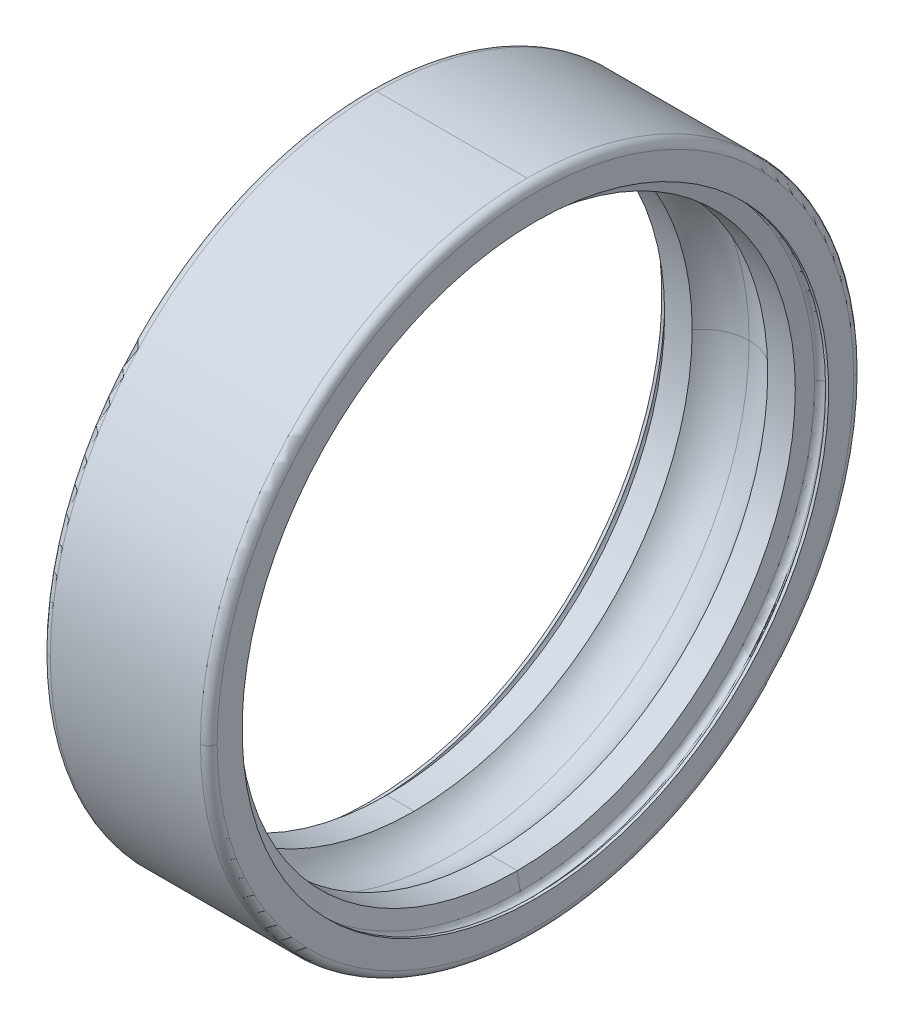
ISO-10303-21;
HEADER;
FILE_DESCRIPTION(('STEP AP214'),'2;1');
FILE_NAME('part.step','',(''),(''),'','','');
FILE_SCHEMA(('AUTOMOTIVE_DESIGN { 1 0 10303 214 1 1 1 1 }'));
ENDSEC;
DATA;
#1=APPLICATION_CONTEXT('core data for automotive mechanical design processes');
#2=APPLICATION_PROTOCOL_DEFINITION('international standard','automotive_design',2000,#1);
#3=PRODUCT_CONTEXT('',#1,'mechanical');
#4=PRODUCT('Part','Part','',(#3));
#5=PRODUCT_RELATED_PRODUCT_CATEGORY('part','',(#4));
#6=PRODUCT_DEFINITION_FORMATION('','',#4);
#7=PRODUCT_DEFINITION_CONTEXT('part definition',#1,'design');
#8=PRODUCT_DEFINITION('design','',#6,#7);
#9=PRODUCT_DEFINITION_SHAPE('','',#8);
#10=(LENGTH_UNIT() NAMED_UNIT(*) SI_UNIT(.MILLI.,.METRE.));
#11=(NAMED_UNIT(*) PLANE_ANGLE_UNIT() SI_UNIT($,.RADIAN.));
#12=(NAMED_UNIT(*) SI_UNIT($,.STERADIAN.) SOLID_ANGLE_UNIT());
#13=UNCERTAINTY_MEASURE_WITH_UNIT(LENGTH_MEASURE(1.E-05),#10,'distance_accuracy_value','');
#14=(GEOMETRIC_REPRESENTATION_CONTEXT(3) GLOBAL_UNCERTAINTY_ASSIGNED_CONTEXT((#13)) GLOBAL_UNIT_ASSIGNED_CONTEXT((#10,
#11,#12)) REPRESENTATION_CONTEXT('',''));
#15=CARTESIAN_POINT('',(0.,0.,0.));
#16=DIRECTION('',(0.,0.,1.));
#17=DIRECTION('',(1.,0.,0.));
#18=AXIS2_PLACEMENT_3D('',#15,#16,#17);
#19=CARTESIAN_POINT('',(11.34,0.,0.));
#20=DIRECTION('',(1.,0.,0.));
#21=DIRECTION('',(0.,0.,-1.));
#22=AXIS2_PLACEMENT_3D('',#19,#20,#21);
#23=TOROIDAL_SURFACE('',#22,21.1,0.44);
#24=CARTESIAN_POINT('',(11.34,0.,0.));
#25=DIRECTION('',(1.,0.,0.));
#26=DIRECTION('',(0.,0.,1.));
#27=AXIS2_PLACEMENT_3D('',#24,#25,#26);
#28=CIRCLE('',#27,21.54);
#29=CARTESIAN_POINT('',(11.34,0.,-21.54));
#30=VERTEX_POINT('',#29);
#31=CARTESIAN_POINT('',(11.34,0.,21.54));
#32=VERTEX_POINT('',#31);
#33=EDGE_CURVE('E483',#30,#32,#28,.T.);
#34=ORIENTED_EDGE('',*,*,#33,.T.);
#35=CARTESIAN_POINT('',(11.34,0.,21.1));
#36=DIRECTION('',(0.,-1.,0.));
#37=DIRECTION('',(0.,0.,1.));
#38=AXIS2_PLACEMENT_3D('',#35,#36,#37);
#39=CIRCLE('',#38,0.44);
#40=CARTESIAN_POINT('',(10.9066845886746,0.,21.1764051981735));
#41=VERTEX_POINT('',#40);
#42=EDGE_CURVE('E269',#32,#41,#39,.T.);
#43=ORIENTED_EDGE('',*,*,#42,.T.);
#44=CARTESIAN_POINT('',(10.9066845886746,0.,0.));
#45=DIRECTION('',(1.,0.,0.));
#46=DIRECTION('',(0.,1.,0.));
#47=AXIS2_PLACEMENT_3D('',#44,#45,#46);
#48=CIRCLE('',#47,21.1764051981735);
#49=CARTESIAN_POINT('',(10.9066845886746,21.1764051981735,0.));
#50=VERTEX_POINT('',#49);
#51=EDGE_CURVE('E34',#50,#41,#48,.T.);
#52=ORIENTED_EDGE('',*,*,#51,.F.);
#53=CARTESIAN_POINT('',(10.9066845886746,0.,0.));
#54=DIRECTION('',(1.,0.,0.));
#55=DIRECTION('',(0.,1.,0.));
#56=AXIS2_PLACEMENT_3D('',#53,#54,#55);
#57=CIRCLE('',#56,21.1764051981735);
#58=CARTESIAN_POINT('',(10.9066845886746,0.,-21.1764051981735));
#59=VERTEX_POINT('',#58);
#60=EDGE_CURVE('E206',#59,#50,#57,.T.);
#61=ORIENTED_EDGE('',*,*,#60,.F.);
#62=CARTESIAN_POINT('',(11.34,0.,-21.1));
#63=DIRECTION('',(0.,-1.,0.));
#64=DIRECTION('',(0.,0.,-1.));
#65=AXIS2_PLACEMENT_3D('',#62,#63,#64);
#66=CIRCLE('',#65,0.44);
#67=EDGE_CURVE('E255',#59,#30,#66,.T.);
#68=ORIENTED_EDGE('',*,*,#67,.T.);
#69=EDGE_LOOP('',(#34,#43,#52,#61,#68));
#70=FACE_BOUND('',#69,.T.);
#71=ADVANCED_FACE('F19',(#70),#23,.F.);
#72=CARTESIAN_POINT('',(11.89,0.,0.));
#73=DIRECTION('',(1.,0.,0.));
#74=DIRECTION('',(0.,1.,0.));
#75=AXIS2_PLACEMENT_3D('',#72,#73,#74);
#76=CYLINDRICAL_SURFACE('',#75,21.1);
#77=DIRECTION('',(1.,0.,0.));
#78=VECTOR('',#77,1.);
#79=CARTESIAN_POINT('',(11.89,21.1,0.));
#80=LINE('',#79,#78);
#81=CARTESIAN_POINT('',(11.78,21.1,0.));
#82=VERTEX_POINT('',#81);
#83=CARTESIAN_POINT('',(12.,21.1,0.));
#84=VERTEX_POINT('',#83);
#85=EDGE_CURVE('E271',#82,#84,#80,.T.);
#86=ORIENTED_EDGE('',*,*,#85,.T.);
#87=CARTESIAN_POINT('',(12.,0.,0.));
#88=DIRECTION('',(1.,0.,0.));
#89=DIRECTION('',(0.,1.,0.));
#90=AXIS2_PLACEMENT_3D('',#87,#88,#89);
#91=CIRCLE('',#90,21.1);
#92=CARTESIAN_POINT('',(12.,-21.1,0.));
#93=VERTEX_POINT('',#92);
#94=EDGE_CURVE('E11',#84,#93,#91,.T.);
#95=ORIENTED_EDGE('',*,*,#94,.T.);
#96=DIRECTION('',(-1.,0.,0.));
#97=VECTOR('',#96,1.);
#98=CARTESIAN_POINT('',(11.89,-21.1,0.));
#99=LINE('',#98,#97);
#100=CARTESIAN_POINT('',(11.78,-21.1,0.));
#101=VERTEX_POINT('',#100);
#102=EDGE_CURVE('E276',#93,#101,#99,.T.);
#103=ORIENTED_EDGE('',*,*,#102,.T.);
#104=CARTESIAN_POINT('',(11.78,0.,0.));
#105=DIRECTION('',(1.,0.,0.));
#106=DIRECTION('',(0.,1.,0.));
#107=AXIS2_PLACEMENT_3D('',#104,#105,#106);
#108=CIRCLE('',#107,21.1);
#109=CARTESIAN_POINT('',(11.78,0.,21.1));
#110=VERTEX_POINT('',#109);
#111=EDGE_CURVE('E244',#110,#101,#108,.T.);
#112=ORIENTED_EDGE('',*,*,#111,.F.);
#113=CARTESIAN_POINT('',(11.78,0.,0.));
#114=DIRECTION('',(1.,0.,0.));
#115=DIRECTION('',(0.,1.,0.));
#116=AXIS2_PLACEMENT_3D('',#113,#114,#115);
#117=CIRCLE('',#116,21.1);
#118=EDGE_CURVE('E469',#82,#110,#117,.T.);
#119=ORIENTED_EDGE('',*,*,#118,.F.);
#120=EDGE_LOOP('',(#86,#95,#103,#112,#119));
#121=FACE_BOUND('',#120,.T.);
#122=ADVANCED_FACE('F502',(#121),#76,.F.);
#123=CARTESIAN_POINT('',(12.,22.,0.));
#124=DIRECTION('',(1.,0.,0.));
#125=DIRECTION('',(0.,1.,0.));
#126=AXIS2_PLACEMENT_3D('',#123,#124,#125);
#127=PLANE('',#126);
#128=ORIENTED_EDGE('',*,*,#94,.F.);
#129=CARTESIAN_POINT('',(12.,0.,0.));
#130=DIRECTION('',(1.,0.,0.));
#131=DIRECTION('',(0.,1.,0.));
#132=AXIS2_PLACEMENT_3D('',#129,#130,#131);
#133=CIRCLE('',#132,21.1);
#134=EDGE_CURVE('E279',#93,#84,#133,.T.);
#135=ORIENTED_EDGE('',*,*,#134,.F.);
#136=EDGE_LOOP('',(#128,#135));
#137=FACE_BOUND('',#136,.T.);
#138=CARTESIAN_POINT('',(12.,0.,0.));
#139=DIRECTION('',(1.,0.,0.));
#140=DIRECTION('',(0.,1.,0.));
#141=AXIS2_PLACEMENT_3D('',#138,#139,#140);
#142=CIRCLE('',#141,22.9);
#143=CARTESIAN_POINT('',(12.,0.,22.9));
#144=VERTEX_POINT('',#143);
#145=CARTESIAN_POINT('',(12.,0.,-22.9));
#146=VERTEX_POINT('',#145);
#147=EDGE_CURVE('E22',#144,#146,#142,.T.);
#148=ORIENTED_EDGE('',*,*,#147,.T.);
#149=CARTESIAN_POINT('',(12.,0.,0.));
#150=DIRECTION('',(1.,0.,0.));
#151=DIRECTION('',(0.,1.,0.));
#152=AXIS2_PLACEMENT_3D('',#149,#150,#151);
#153=CIRCLE('',#152,22.9);
#154=EDGE_CURVE('E285',#146,#144,#153,.T.);
#155=ORIENTED_EDGE('',*,*,#154,.T.);
#156=EDGE_LOOP('',(#148,#155));
#157=FACE_BOUND('',#156,.T.);
#158=ADVANCED_FACE('F504',(#137,#157),#127,.T.);
#159=CARTESIAN_POINT('',(11.4,0.,0.));
#160=DIRECTION('',(1.,0.,0.));
#161=DIRECTION('',(0.,0.,-1.));
#162=AXIS2_PLACEMENT_3D('',#159,#160,#161);
#163=TOROIDAL_SURFACE('',#162,22.9,0.6);
#164=CARTESIAN_POINT('',(11.4,0.,-22.9));
#165=DIRECTION('',(0.,-1.,0.));
#166=DIRECTION('',(0.,0.,-1.));
#167=AXIS2_PLACEMENT_3D('',#164,#165,#166);
#168=CIRCLE('',#167,0.6);
#169=CARTESIAN_POINT('',(11.4,0.,-23.5));
#170=VERTEX_POINT('',#169);
#171=EDGE_CURVE('E282',#170,#146,#168,.T.);
#172=ORIENTED_EDGE('',*,*,#171,.T.);
#173=ORIENTED_EDGE('',*,*,#147,.F.);
#174=CARTESIAN_POINT('',(11.4,0.,22.9));
#175=DIRECTION('',(0.,-1.,0.));
#176=DIRECTION('',(0.,0.,1.));
#177=AXIS2_PLACEMENT_3D('',#174,#175,#176);
#178=CIRCLE('',#177,0.6);
#179=CARTESIAN_POINT('',(11.4,0.,23.5));
#180=VERTEX_POINT('',#179);
#181=EDGE_CURVE('E289',#144,#180,#178,.T.);
#182=ORIENTED_EDGE('',*,*,#181,.T.);
#183=CARTESIAN_POINT('',(11.4,0.,0.));
#184=DIRECTION('',(1.,0.,0.));
#185=DIRECTION('',(0.,1.,0.));
#186=AXIS2_PLACEMENT_3D('',#183,#184,#185);
#187=CIRCLE('',#186,23.5);
#188=CARTESIAN_POINT('',(11.4,-23.5,0.));
#189=VERTEX_POINT('',#188);
#190=EDGE_CURVE('E299',#180,#189,#187,.T.);
#191=ORIENTED_EDGE('',*,*,#190,.T.);
#192=CARTESIAN_POINT('',(11.4,0.,0.));
#193=DIRECTION('',(1.,0.,0.));
#194=DIRECTION('',(0.,1.,0.));
#195=AXIS2_PLACEMENT_3D('',#192,#193,#194);
#196=CIRCLE('',#195,23.5);
#197=EDGE_CURVE('E216',#189,#170,#196,.T.);
#198=ORIENTED_EDGE('',*,*,#197,.T.);
#199=EDGE_LOOP('',(#172,#173,#182,#191,#198));
#200=FACE_BOUND('',#199,.T.);
#201=ADVANCED_FACE('F422',(#200),#163,.T.);
#202=CARTESIAN_POINT('',(6.,0.,0.));
#203=DIRECTION('',(1.,0.,0.));
#204=DIRECTION('',(0.,1.,0.));
#205=AXIS2_PLACEMENT_3D('',#202,#203,#204);
#206=CYLINDRICAL_SURFACE('',#205,23.5);
#207=DIRECTION('',(1.,0.,0.));
#208=VECTOR('',#207,1.);
#209=CARTESIAN_POINT('',(6.,23.5,0.));
#210=LINE('',#209,#208);
#211=CARTESIAN_POINT('',(0.6,23.5,0.));
#212=VERTEX_POINT('',#211);
#213=CARTESIAN_POINT('',(11.4,23.5,0.));
#214=VERTEX_POINT('',#213);
#215=EDGE_CURVE('E288',#212,#214,#210,.T.);
#216=ORIENTED_EDGE('',*,*,#215,.T.);
#217=CARTESIAN_POINT('',(11.4,0.,0.));
#218=DIRECTION('',(1.,0.,0.));
#219=DIRECTION('',(0.,1.,0.));
#220=AXIS2_PLACEMENT_3D('',#217,#218,#219);
#221=CIRCLE('',#220,23.5);
#222=EDGE_CURVE('E284',#170,#214,#221,.T.);
#223=ORIENTED_EDGE('',*,*,#222,.F.);
#224=ORIENTED_EDGE('',*,*,#197,.F.);
#225=DIRECTION('',(-1.,0.,0.));
#226=VECTOR('',#225,1.);
#227=CARTESIAN_POINT('',(6.,-23.5,0.));
#228=LINE('',#227,#226);
#229=CARTESIAN_POINT('',(0.6,-23.5,0.));
#230=VERTEX_POINT('',#229);
#231=EDGE_CURVE('E297',#189,#230,#228,.T.);
#232=ORIENTED_EDGE('',*,*,#231,.T.);
#233=CARTESIAN_POINT('',(0.6,0.,0.));
#234=DIRECTION('',(1.,0.,0.));
#235=DIRECTION('',(0.,1.,0.));
#236=AXIS2_PLACEMENT_3D('',#233,#234,#235);
#237=CIRCLE('',#236,23.5);
#238=CARTESIAN_POINT('',(0.6,0.,-23.5));
#239=VERTEX_POINT('',#238);
#240=EDGE_CURVE('E215',#230,#239,#237,.T.);
#241=ORIENTED_EDGE('',*,*,#240,.T.);
#242=CARTESIAN_POINT('',(0.6,0.,0.));
#243=DIRECTION('',(1.,0.,0.));
#244=DIRECTION('',(0.,1.,0.));
#245=AXIS2_PLACEMENT_3D('',#242,#243,#244);
#246=CIRCLE('',#245,23.5);
#247=EDGE_CURVE('E311',#239,#212,#246,.T.);
#248=ORIENTED_EDGE('',*,*,#247,.T.);
#249=EDGE_LOOP('',(#216,#223,#224,#232,#241,#248));
#250=FACE_BOUND('',#249,.T.);
#251=ADVANCED_FACE('F415',(#250),#206,.T.);
#252=CARTESIAN_POINT('',(0.6,0.,0.));
#253=DIRECTION('',(1.,0.,0.));
#254=DIRECTION('',(0.,0.,-1.));
#255=AXIS2_PLACEMENT_3D('',#252,#253,#254);
#256=TOROIDAL_SURFACE('',#255,22.9,0.6);
#257=CARTESIAN_POINT('',(0.6,0.,-22.9));
#258=DIRECTION('',(0.,-1.,0.));
#259=DIRECTION('',(0.,0.,-1.));
#260=AXIS2_PLACEMENT_3D('',#257,#258,#259);
#261=CIRCLE('',#260,0.6);
#262=CARTESIAN_POINT('',(0.,0.,-22.9));
#263=VERTEX_POINT('',#262);
#264=EDGE_CURVE('E301',#263,#239,#261,.T.);
#265=ORIENTED_EDGE('',*,*,#264,.T.);
#266=ORIENTED_EDGE('',*,*,#240,.F.);
#267=CARTESIAN_POINT('',(0.6,0.,0.));
#268=DIRECTION('',(1.,0.,0.));
#269=DIRECTION('',(0.,1.,0.));
#270=AXIS2_PLACEMENT_3D('',#267,#268,#269);
#271=CIRCLE('',#270,23.5);
#272=CARTESIAN_POINT('',(0.6,0.,23.5));
#273=VERTEX_POINT('',#272);
#274=EDGE_CURVE('E294',#273,#230,#271,.T.);
#275=ORIENTED_EDGE('',*,*,#274,.F.);
#276=CARTESIAN_POINT('',(0.6,0.,22.9));
#277=DIRECTION('',(0.,-1.,0.));
#278=DIRECTION('',(0.,0.,1.));
#279=AXIS2_PLACEMENT_3D('',#276,#277,#278);
#280=CIRCLE('',#279,0.6);
#281=CARTESIAN_POINT('',(0.,0.,22.9));
#282=VERTEX_POINT('',#281);
#283=EDGE_CURVE('E308',#273,#282,#280,.T.);
#284=ORIENTED_EDGE('',*,*,#283,.T.);
#285=CARTESIAN_POINT('',(0.,0.,0.));
#286=DIRECTION('',(1.,0.,0.));
#287=DIRECTION('',(0.,1.,0.));
#288=AXIS2_PLACEMENT_3D('',#285,#286,#287);
#289=CIRCLE('',#288,22.9);
#290=EDGE_CURVE('E214',#282,#263,#289,.T.);
#291=ORIENTED_EDGE('',*,*,#290,.T.);
#292=EDGE_LOOP('',(#265,#266,#275,#284,#291));
#293=FACE_BOUND('',#292,.T.);
#294=ADVANCED_FACE('F399',(#293),#256,.T.);
#295=CARTESIAN_POINT('',(0.,22.,0.));
#296=DIRECTION('',(-1.,0.,0.));
#297=DIRECTION('',(0.,0.,1.));
#298=AXIS2_PLACEMENT_3D('',#295,#296,#297);
#299=PLANE('',#298);
#300=CARTESIAN_POINT('',(0.,0.,0.));
#301=DIRECTION('',(1.,0.,0.));
#302=DIRECTION('',(0.,1.,0.));
#303=AXIS2_PLACEMENT_3D('',#300,#301,#302);
#304=CIRCLE('',#303,21.1);
#305=CARTESIAN_POINT('',(0.,21.1,0.));
#306=VERTEX_POINT('',#305);
#307=CARTESIAN_POINT('',(0.,-21.1,0.));
#308=VERTEX_POINT('',#307);
#309=EDGE_CURVE('E211',#306,#308,#304,.T.);
#310=ORIENTED_EDGE('',*,*,#309,.T.);
#311=CARTESIAN_POINT('',(0.,0.,0.));
#312=DIRECTION('',(1.,0.,0.));
#313=DIRECTION('',(0.,1.,0.));
#314=AXIS2_PLACEMENT_3D('',#311,#312,#313);
#315=CIRCLE('',#314,21.1);
#316=EDGE_CURVE('E316',#308,#306,#315,.T.);
#317=ORIENTED_EDGE('',*,*,#316,.T.);
#318=EDGE_LOOP('',(#310,#317));
#319=FACE_BOUND('',#318,.T.);
#320=CARTESIAN_POINT('',(0.,0.,0.));
#321=DIRECTION('',(1.,0.,0.));
#322=DIRECTION('',(0.,1.,0.));
#323=AXIS2_PLACEMENT_3D('',#320,#321,#322);
#324=CIRCLE('',#323,22.9);
#325=EDGE_CURVE('E304',#263,#282,#324,.T.);
#326=ORIENTED_EDGE('',*,*,#325,.F.);
#327=ORIENTED_EDGE('',*,*,#290,.F.);
#328=EDGE_LOOP('',(#326,#327));
#329=FACE_BOUND('',#328,.T.);
#330=ADVANCED_FACE('F396',(#319,#329),#299,.T.);
#331=CARTESIAN_POINT('',(0.11,0.,0.));
#332=DIRECTION('',(1.,0.,0.));
#333=DIRECTION('',(0.,1.,0.));
#334=AXIS2_PLACEMENT_3D('',#331,#332,#333);
#335=CYLINDRICAL_SURFACE('',#334,21.1);
#336=DIRECTION('',(1.,0.,0.));
#337=VECTOR('',#336,1.);
#338=CARTESIAN_POINT('',(0.11,21.1,0.));
#339=LINE('',#338,#337);
#340=CARTESIAN_POINT('',(0.22,21.1,0.));
#341=VERTEX_POINT('',#340);
#342=EDGE_CURVE('E313',#306,#341,#339,.T.);
#343=ORIENTED_EDGE('',*,*,#342,.T.);
#344=CARTESIAN_POINT('',(0.22,0.,0.));
#345=DIRECTION('',(1.,0.,0.));
#346=DIRECTION('',(0.,1.,0.));
#347=AXIS2_PLACEMENT_3D('',#344,#345,#346);
#348=CIRCLE('',#347,21.1);
#349=CARTESIAN_POINT('',(0.22,0.,21.1));
#350=VERTEX_POINT('',#349);
#351=EDGE_CURVE('E210',#341,#350,#348,.T.);
#352=ORIENTED_EDGE('',*,*,#351,.T.);
#353=CARTESIAN_POINT('',(0.22,0.,0.));
#354=DIRECTION('',(1.,0.,0.));
#355=DIRECTION('',(0.,1.,0.));
#356=AXIS2_PLACEMENT_3D('',#353,#354,#355);
#357=CIRCLE('',#356,21.1);
#358=CARTESIAN_POINT('',(0.22,-21.1,0.));
#359=VERTEX_POINT('',#358);
#360=EDGE_CURVE('E249',#350,#359,#357,.T.);
#361=ORIENTED_EDGE('',*,*,#360,.T.);
#362=DIRECTION('',(-1.,0.,0.));
#363=VECTOR('',#362,1.);
#364=CARTESIAN_POINT('',(0.11,-21.1,0.));
#365=LINE('',#364,#363);
#366=EDGE_CURVE('E319',#359,#308,#365,.T.);
#367=ORIENTED_EDGE('',*,*,#366,.T.);
#368=ORIENTED_EDGE('',*,*,#309,.F.);
#369=EDGE_LOOP('',(#343,#352,#361,#367,#368));
#370=FACE_BOUND('',#369,.T.);
#371=ADVANCED_FACE('F393',(#370),#335,.F.);
#372=CARTESIAN_POINT('',(0.66,0.,0.));
#373=DIRECTION('',(1.,0.,0.));
#374=DIRECTION('',(0.,0.,-1.));
#375=AXIS2_PLACEMENT_3D('',#372,#373,#374);
#376=TOROIDAL_SURFACE('',#375,21.1,0.44);
#377=CARTESIAN_POINT('',(0.66,0.,0.));
#378=DIRECTION('',(1.,0.,0.));
#379=DIRECTION('',(0.,0.,1.));
#380=AXIS2_PLACEMENT_3D('',#377,#378,#379);
#381=CIRCLE('',#380,21.54);
#382=CARTESIAN_POINT('',(0.66,0.,-21.54));
#383=VERTEX_POINT('',#382);
#384=CARTESIAN_POINT('',(0.66,0.,21.54));
#385=VERTEX_POINT('',#384);
#386=EDGE_CURVE('E350',#383,#385,#381,.T.);
#387=ORIENTED_EDGE('',*,*,#386,.T.);
#388=CARTESIAN_POINT('',(0.66,0.,21.1));
#389=DIRECTION('',(0.,-1.,0.));
#390=DIRECTION('',(0.,0.,1.));
#391=AXIS2_PLACEMENT_3D('',#388,#389,#390);
#392=CIRCLE('',#391,0.44);
#393=EDGE_CURVE('E245',#385,#350,#392,.T.);
#394=ORIENTED_EDGE('',*,*,#393,.T.);
#395=ORIENTED_EDGE('',*,*,#351,.F.);
#396=CARTESIAN_POINT('',(0.22,0.,0.));
#397=DIRECTION('',(1.,0.,0.));
#398=DIRECTION('',(0.,1.,0.));
#399=AXIS2_PLACEMENT_3D('',#396,#397,#398);
#400=CIRCLE('',#399,21.1);
#401=CARTESIAN_POINT('',(0.22,0.,-21.1));
#402=VERTEX_POINT('',#401);
#403=EDGE_CURVE('E230',#402,#341,#400,.T.);
#404=ORIENTED_EDGE('',*,*,#403,.F.);
#405=CARTESIAN_POINT('',(0.66,0.,-21.1));
#406=DIRECTION('',(0.,-1.,0.));
#407=DIRECTION('',(0.,0.,-1.));
#408=AXIS2_PLACEMENT_3D('',#405,#406,#407);
#409=CIRCLE('',#408,0.44);
#410=EDGE_CURVE('E233',#402,#383,#409,.T.);
#411=ORIENTED_EDGE('',*,*,#410,.T.);
#412=EDGE_LOOP('',(#387,#394,#395,#404,#411));
#413=FACE_BOUND('',#412,.T.);
#414=ADVANCED_FACE('F386',(#413),#376,.F.);
#415=CARTESIAN_POINT('',(1.19703139966721,0.,0.));
#416=DIRECTION('',(-1.,0.,0.));
#417=DIRECTION('',(0.,1.,0.));
#418=AXIS2_PLACEMENT_3D('',#415,#416,#417);
#419=CONICAL_SURFACE('',#418,20.5882025990867,1.39626340159546);
#420=DIRECTION('',(0.17364817766693,-0.984807753012208,0.));
#421=VECTOR('',#420,1.);
#422=CARTESIAN_POINT('',(1.19703139966721,20.5882025990867,0.));
#423=LINE('',#422,#421);
#424=CARTESIAN_POINT('',(1.09331541132537,21.1764051981735,0.));
#425=VERTEX_POINT('',#424);
#426=CARTESIAN_POINT('',(1.30074738800904,20.,0.));
#427=VERTEX_POINT('',#426);
#428=EDGE_CURVE('E248',#425,#427,#423,.T.);
#429=ORIENTED_EDGE('',*,*,#428,.T.);
#430=CARTESIAN_POINT('',(1.30074738800904,0.,0.));
#431=DIRECTION('',(1.,0.,0.));
#432=DIRECTION('',(0.,1.,0.));
#433=AXIS2_PLACEMENT_3D('',#430,#431,#432);
#434=CIRCLE('',#433,20.);
#435=CARTESIAN_POINT('',(1.30074738800904,-20.,0.));
#436=VERTEX_POINT('',#435);
#437=EDGE_CURVE('E178',#427,#436,#434,.T.);
#438=ORIENTED_EDGE('',*,*,#437,.T.);
#439=DIRECTION('',(-0.17364817766693,-0.984807753012208,0.));
#440=VECTOR('',#439,1.);
#441=CARTESIAN_POINT('',(1.19703139966721,-20.5882025990867,0.));
#442=LINE('',#441,#440);
#443=CARTESIAN_POINT('',(1.09331541132537,-21.1764051981735,0.));
#444=VERTEX_POINT('',#443);
#445=EDGE_CURVE('E256',#436,#444,#442,.T.);
#446=ORIENTED_EDGE('',*,*,#445,.T.);
#447=CARTESIAN_POINT('',(1.09331541132537,0.,0.));
#448=DIRECTION('',(1.,0.,0.));
#449=DIRECTION('',(0.,1.,0.));
#450=AXIS2_PLACEMENT_3D('',#447,#448,#449);
#451=CIRCLE('',#450,21.1764051981735);
#452=CARTESIAN_POINT('',(1.09331541132537,0.,21.1764051981735));
#453=VERTEX_POINT('',#452);
#454=EDGE_CURVE('E235',#453,#444,#451,.T.);
#455=ORIENTED_EDGE('',*,*,#454,.F.);
#456=CARTESIAN_POINT('',(1.09331541132537,0.,0.));
#457=DIRECTION('',(1.,0.,0.));
#458=DIRECTION('',(0.,1.,0.));
#459=AXIS2_PLACEMENT_3D('',#456,#457,#458);
#460=CIRCLE('',#459,21.1764051981735);
#461=EDGE_CURVE('E337',#425,#453,#460,.T.);
#462=ORIENTED_EDGE('',*,*,#461,.F.);
#463=EDGE_LOOP('',(#429,#438,#446,#455,#462));
#464=FACE_BOUND('',#463,.T.);
#465=ADVANCED_FACE('F333',(#464),#419,.F.);
#466=CARTESIAN_POINT('',(2.29201970387529,0.,0.));
#467=DIRECTION('',(1.,0.,0.));
#468=DIRECTION('',(0.,1.,0.));
#469=AXIS2_PLACEMENT_3D('',#466,#467,#468);
#470=CYLINDRICAL_SURFACE('',#469,20.);
#471=DIRECTION('',(1.,0.,0.));
#472=VECTOR('',#471,1.);
#473=CARTESIAN_POINT('',(2.29201970387529,20.,0.));
#474=LINE('',#473,#472);
#475=CARTESIAN_POINT('',(3.28329201974155,20.,0.));
#476=VERTEX_POINT('',#475);
#477=EDGE_CURVE('E174',#427,#476,#474,.T.);
#478=ORIENTED_EDGE('',*,*,#477,.T.);
#479=CARTESIAN_POINT('',(3.28329201974155,0.,0.));
#480=DIRECTION('',(1.,0.,0.));
#481=DIRECTION('',(0.,1.,0.));
#482=AXIS2_PLACEMENT_3D('',#479,#480,#481);
#483=CIRCLE('',#482,20.);
#484=CARTESIAN_POINT('',(3.28329201974155,0.,20.));
#485=VERTEX_POINT('',#484);
#486=EDGE_CURVE('E166',#476,#485,#483,.T.);
#487=ORIENTED_EDGE('',*,*,#486,.T.);
#488=CARTESIAN_POINT('',(3.28329201974155,0.,0.));
#489=DIRECTION('',(1.,0.,0.));
#490=DIRECTION('',(0.,1.,0.));
#491=AXIS2_PLACEMENT_3D('',#488,#489,#490);
#492=CIRCLE('',#491,20.);
#493=CARTESIAN_POINT('',(3.28329201974155,-20.,0.));
#494=VERTEX_POINT('',#493);
#495=EDGE_CURVE('E171',#485,#494,#492,.T.);
#496=ORIENTED_EDGE('',*,*,#495,.T.);
#497=DIRECTION('',(-1.,0.,0.));
#498=VECTOR('',#497,1.);
#499=CARTESIAN_POINT('',(2.29201970387529,-20.,0.));
#500=LINE('',#499,#498);
#501=EDGE_CURVE('E273',#494,#436,#500,.T.);
#502=ORIENTED_EDGE('',*,*,#501,.T.);
#503=ORIENTED_EDGE('',*,*,#437,.F.);
#504=EDGE_LOOP('',(#478,#487,#496,#502,#503));
#505=FACE_BOUND('',#504,.T.);
#506=ADVANCED_FACE('F168',(#505),#470,.F.);
#507=CARTESIAN_POINT('',(6.,0.,0.));
#508=DIRECTION('',(1.,0.,0.));
#509=DIRECTION('',(0.,0.,-1.));
#510=AXIS2_PLACEMENT_3D('',#507,#508,#509);
#511=TOROIDAL_SURFACE('',#510,18.,3.3735);
#512=CARTESIAN_POINT('',(6.,0.,0.));
#513=DIRECTION('',(1.,0.,0.));
#514=DIRECTION('',(0.,0.,1.));
#515=AXIS2_PLACEMENT_3D('',#512,#513,#514);
#516=CIRCLE('',#515,21.3735);
#517=CARTESIAN_POINT('',(6.,0.,-21.3735));
#518=VERTEX_POINT('',#517);
#519=CARTESIAN_POINT('',(6.,0.,21.3735));
#520=VERTEX_POINT('',#519);
#521=EDGE_CURVE('E184',#518,#520,#516,.T.);
#522=ORIENTED_EDGE('',*,*,#521,.T.);
#523=CARTESIAN_POINT('',(6.,0.,18.));
#524=DIRECTION('',(0.,-1.,0.));
#525=DIRECTION('',(0.,0.,1.));
#526=AXIS2_PLACEMENT_3D('',#523,#524,#525);
#527=CIRCLE('',#526,3.3735);
#528=EDGE_CURVE('E181',#520,#485,#527,.T.);
#529=ORIENTED_EDGE('',*,*,#528,.T.);
#530=ORIENTED_EDGE('',*,*,#486,.F.);
#531=CARTESIAN_POINT('',(3.28329201974155,0.,0.));
#532=DIRECTION('',(1.,0.,0.));
#533=DIRECTION('',(0.,1.,0.));
#534=AXIS2_PLACEMENT_3D('',#531,#532,#533);
#535=CIRCLE('',#534,20.);
#536=CARTESIAN_POINT('',(3.28329201974155,0.,-20.));
#537=VERTEX_POINT('',#536);
#538=EDGE_CURVE('E196',#537,#476,#535,.T.);
#539=ORIENTED_EDGE('',*,*,#538,.F.);
#540=CARTESIAN_POINT('',(6.,0.,-18.));
#541=DIRECTION('',(0.,-1.,0.));
#542=DIRECTION('',(0.,0.,-1.));
#543=AXIS2_PLACEMENT_3D('',#540,#541,#542);
#544=CIRCLE('',#543,3.3735);
#545=EDGE_CURVE('E194',#537,#518,#544,.T.);
#546=ORIENTED_EDGE('',*,*,#545,.T.);
#547=EDGE_LOOP('',(#522,#529,#530,#539,#546));
#548=FACE_BOUND('',#547,.T.);
#549=ADVANCED_FACE('F182',(#548),#511,.F.);
#550=CARTESIAN_POINT('',(9.70798029612471,0.,0.));
#551=DIRECTION('',(1.,0.,0.));
#552=DIRECTION('',(0.,1.,0.));
#553=AXIS2_PLACEMENT_3D('',#550,#551,#552);
#554=CYLINDRICAL_SURFACE('',#553,20.);
#555=DIRECTION('',(1.,0.,0.));
#556=VECTOR('',#555,1.);
#557=CARTESIAN_POINT('',(9.70798029612471,20.,0.));
#558=LINE('',#557,#556);
#559=CARTESIAN_POINT('',(8.71670798025845,20.,0.));
#560=VERTEX_POINT('',#559);
#561=CARTESIAN_POINT('',(10.699252611991,20.,0.));
#562=VERTEX_POINT('',#561);
#563=EDGE_CURVE('E188',#560,#562,#558,.T.);
#564=ORIENTED_EDGE('',*,*,#563,.T.);
#565=CARTESIAN_POINT('',(10.699252611991,0.,0.));
#566=DIRECTION('',(1.,0.,0.));
#567=DIRECTION('',(0.,1.,0.));
#568=AXIS2_PLACEMENT_3D('',#565,#566,#567);
#569=CIRCLE('',#568,20.);
#570=CARTESIAN_POINT('',(10.699252611991,-20.,0.));
#571=VERTEX_POINT('',#570);
#572=EDGE_CURVE('E43',#562,#571,#569,.T.);
#573=ORIENTED_EDGE('',*,*,#572,.T.);
#574=DIRECTION('',(-1.,0.,0.));
#575=VECTOR('',#574,1.);
#576=CARTESIAN_POINT('',(9.70798029612471,-20.,0.));
#577=LINE('',#576,#575);
#578=CARTESIAN_POINT('',(8.71670798025845,-20.,0.));
#579=VERTEX_POINT('',#578);
#580=EDGE_CURVE('E452',#571,#579,#577,.T.);
#581=ORIENTED_EDGE('',*,*,#580,.T.);
#582=CARTESIAN_POINT('',(8.71670798025845,0.,0.));
#583=DIRECTION('',(1.,0.,0.));
#584=DIRECTION('',(0.,1.,0.));
#585=AXIS2_PLACEMENT_3D('',#582,#583,#584);
#586=CIRCLE('',#585,20.);
#587=CARTESIAN_POINT('',(8.71670798025845,0.,20.));
#588=VERTEX_POINT('',#587);
#589=EDGE_CURVE('E365',#588,#579,#586,.T.);
#590=ORIENTED_EDGE('',*,*,#589,.F.);
#591=CARTESIAN_POINT('',(8.71670798025845,0.,0.));
#592=DIRECTION('',(1.,0.,0.));
#593=DIRECTION('',(0.,1.,0.));
#594=AXIS2_PLACEMENT_3D('',#591,#592,#593);
#595=CIRCLE('',#594,20.);
#596=EDGE_CURVE('E449',#560,#588,#595,.T.);
#597=ORIENTED_EDGE('',*,*,#596,.F.);
#598=EDGE_LOOP('',(#564,#573,#581,#590,#597));
#599=FACE_BOUND('',#598,.T.);
#600=ADVANCED_FACE('F447',(#599),#554,.F.);
#601=CARTESIAN_POINT('',(10.8029686003328,0.,0.));
#602=DIRECTION('',(1.,0.,0.));
#603=DIRECTION('',(0.,1.,0.));
#604=AXIS2_PLACEMENT_3D('',#601,#602,#603);
#605=CONICAL_SURFACE('',#604,20.5882025990867,1.39626340159546);
#606=DIRECTION('',(0.173648177666931,0.984807753012208,0.));
#607=VECTOR('',#606,1.);
#608=CARTESIAN_POINT('',(10.8029686003328,20.5882025990867,0.));
#609=LINE('',#608,#607);
#610=EDGE_CURVE('E200',#562,#50,#609,.T.);
#611=ORIENTED_EDGE('',*,*,#610,.T.);
#612=ORIENTED_EDGE('',*,*,#51,.T.);
#613=CARTESIAN_POINT('',(10.9066845886746,0.,0.));
#614=DIRECTION('',(1.,0.,0.));
#615=DIRECTION('',(0.,1.,0.));
#616=AXIS2_PLACEMENT_3D('',#613,#614,#615);
#617=CIRCLE('',#616,21.1764051981735);
#618=CARTESIAN_POINT('',(10.9066845886746,-21.1764051981735,0.));
#619=VERTEX_POINT('',#618);
#620=EDGE_CURVE('E266',#41,#619,#617,.T.);
#621=ORIENTED_EDGE('',*,*,#620,.T.);
#622=DIRECTION('',(-0.173648177666931,0.984807753012208,0.));
#623=VECTOR('',#622,1.);
#624=CARTESIAN_POINT('',(10.8029686003328,-20.5882025990867,0.));
#625=LINE('',#624,#623);
#626=EDGE_CURVE('E203',#619,#571,#625,.T.);
#627=ORIENTED_EDGE('',*,*,#626,.T.);
#628=ORIENTED_EDGE('',*,*,#572,.F.);
#629=EDGE_LOOP('',(#611,#612,#621,#627,#628));
#630=FACE_BOUND('',#629,.T.);
#631=ADVANCED_FACE('F493',(#630),#605,.F.);
#632=CARTESIAN_POINT('',(10.8029686003328,0.,0.));
#633=DIRECTION('',(1.,0.,0.));
#634=DIRECTION('',(0.,1.,0.));
#635=AXIS2_PLACEMENT_3D('',#632,#633,#634);
#636=CONICAL_SURFACE('',#635,20.5882025990867,1.39626340159546);
#637=ORIENTED_EDGE('',*,*,#610,.F.);
#638=CARTESIAN_POINT('',(10.699252611991,0.,0.));
#639=DIRECTION('',(1.,0.,0.));
#640=DIRECTION('',(0.,1.,0.));
#641=AXIS2_PLACEMENT_3D('',#638,#639,#640);
#642=CIRCLE('',#641,20.);
#643=EDGE_CURVE('E204',#571,#562,#642,.T.);
#644=ORIENTED_EDGE('',*,*,#643,.F.);
#645=ORIENTED_EDGE('',*,*,#626,.F.);
#646=CARTESIAN_POINT('',(10.9066845886746,0.,0.));
#647=DIRECTION('',(1.,0.,0.));
#648=DIRECTION('',(0.,1.,0.));
#649=AXIS2_PLACEMENT_3D('',#646,#647,#648);
#650=CIRCLE('',#649,21.1764051981735);
#651=EDGE_CURVE('E261',#619,#59,#650,.T.);
#652=ORIENTED_EDGE('',*,*,#651,.T.);
#653=ORIENTED_EDGE('',*,*,#60,.T.);
#654=EDGE_LOOP('',(#637,#644,#645,#652,#653));
#655=FACE_BOUND('',#654,.T.);
#656=ADVANCED_FACE('F491',(#655),#636,.F.);
#657=CARTESIAN_POINT('',(9.70798029612471,0.,0.));
#658=DIRECTION('',(1.,0.,0.));
#659=DIRECTION('',(0.,1.,0.));
#660=AXIS2_PLACEMENT_3D('',#657,#658,#659);
#661=CYLINDRICAL_SURFACE('',#660,20.);
#662=ORIENTED_EDGE('',*,*,#563,.F.);
#663=CARTESIAN_POINT('',(8.71670798025845,0.,0.));
#664=DIRECTION('',(1.,0.,0.));
#665=DIRECTION('',(0.,1.,0.));
#666=AXIS2_PLACEMENT_3D('',#663,#664,#665);
#667=CIRCLE('',#666,20.);
#668=CARTESIAN_POINT('',(8.71670798025845,0.,-20.));
#669=VERTEX_POINT('',#668);
#670=EDGE_CURVE('E459',#669,#560,#667,.T.);
#671=ORIENTED_EDGE('',*,*,#670,.F.);
#672=CARTESIAN_POINT('',(8.71670798025845,0.,0.));
#673=DIRECTION('',(1.,0.,0.));
#674=DIRECTION('',(0.,1.,0.));
#675=AXIS2_PLACEMENT_3D('',#672,#673,#674);
#676=CIRCLE('',#675,20.);
#677=EDGE_CURVE('E371',#579,#669,#676,.T.);
#678=ORIENTED_EDGE('',*,*,#677,.F.);
#679=ORIENTED_EDGE('',*,*,#580,.F.);
#680=ORIENTED_EDGE('',*,*,#643,.T.);
#681=EDGE_LOOP('',(#662,#671,#678,#679,#680));
#682=FACE_BOUND('',#681,.T.);
#683=ADVANCED_FACE('F488',(#682),#661,.F.);
#684=CARTESIAN_POINT('',(6.,0.,0.));
#685=DIRECTION('',(1.,0.,0.));
#686=DIRECTION('',(0.,0.,-1.));
#687=AXIS2_PLACEMENT_3D('',#684,#685,#686);
#688=TOROIDAL_SURFACE('',#687,18.,3.3735);
#689=CARTESIAN_POINT('',(6.,0.,0.));
#690=DIRECTION('',(1.,0.,0.));
#691=DIRECTION('',(0.,0.,1.));
#692=AXIS2_PLACEMENT_3D('',#689,#690,#691);
#693=CIRCLE('',#692,21.3735);
#694=EDGE_CURVE('E363',#520,#518,#693,.T.);
#695=ORIENTED_EDGE('',*,*,#694,.T.);
#696=ORIENTED_EDGE('',*,*,#545,.F.);
#697=CARTESIAN_POINT('',(3.28329201974155,0.,0.));
#698=DIRECTION('',(1.,0.,0.));
#699=DIRECTION('',(0.,1.,0.));
#700=AXIS2_PLACEMENT_3D('',#697,#698,#699);
#701=CIRCLE('',#700,20.);
#702=EDGE_CURVE('E192',#494,#537,#701,.T.);
#703=ORIENTED_EDGE('',*,*,#702,.F.);
#704=ORIENTED_EDGE('',*,*,#495,.F.);
#705=ORIENTED_EDGE('',*,*,#528,.F.);
#706=EDGE_LOOP('',(#695,#696,#703,#704,#705));
#707=FACE_BOUND('',#706,.T.);
#708=ADVANCED_FACE('F190',(#707),#688,.F.);
#709=CARTESIAN_POINT('',(2.29201970387529,0.,0.));
#710=DIRECTION('',(1.,0.,0.));
#711=DIRECTION('',(0.,1.,0.));
#712=AXIS2_PLACEMENT_3D('',#709,#710,#711);
#713=CYLINDRICAL_SURFACE('',#712,20.);
#714=ORIENTED_EDGE('',*,*,#477,.F.);
#715=CARTESIAN_POINT('',(1.30074738800904,0.,0.));
#716=DIRECTION('',(1.,0.,0.));
#717=DIRECTION('',(0.,1.,0.));
#718=AXIS2_PLACEMENT_3D('',#715,#716,#717);
#719=CIRCLE('',#718,20.);
#720=EDGE_CURVE('E258',#436,#427,#719,.T.);
#721=ORIENTED_EDGE('',*,*,#720,.F.);
#722=ORIENTED_EDGE('',*,*,#501,.F.);
#723=ORIENTED_EDGE('',*,*,#702,.T.);
#724=ORIENTED_EDGE('',*,*,#538,.T.);
#725=EDGE_LOOP('',(#714,#721,#722,#723,#724));
#726=FACE_BOUND('',#725,.T.);
#727=ADVANCED_FACE('F327',(#726),#713,.F.);
#728=CARTESIAN_POINT('',(1.19703139966721,0.,0.));
#729=DIRECTION('',(-1.,0.,0.));
#730=DIRECTION('',(0.,1.,0.));
#731=AXIS2_PLACEMENT_3D('',#728,#729,#730);
#732=CONICAL_SURFACE('',#731,20.5882025990867,1.39626340159546);
#733=ORIENTED_EDGE('',*,*,#428,.F.);
#734=CARTESIAN_POINT('',(1.09331541132537,0.,0.));
#735=DIRECTION('',(1.,0.,0.));
#736=DIRECTION('',(0.,1.,0.));
#737=AXIS2_PLACEMENT_3D('',#734,#735,#736);
#738=CIRCLE('',#737,21.1764051981735);
#739=CARTESIAN_POINT('',(1.09331541132537,0.,-21.1764051981735));
#740=VERTEX_POINT('',#739);
#741=EDGE_CURVE('E339',#740,#425,#738,.T.);
#742=ORIENTED_EDGE('',*,*,#741,.F.);
#743=CARTESIAN_POINT('',(1.09331541132537,0.,0.));
#744=DIRECTION('',(1.,0.,0.));
#745=DIRECTION('',(0.,1.,0.));
#746=AXIS2_PLACEMENT_3D('',#743,#744,#745);
#747=CIRCLE('',#746,21.1764051981735);
#748=EDGE_CURVE('E238',#444,#740,#747,.T.);
#749=ORIENTED_EDGE('',*,*,#748,.F.);
#750=ORIENTED_EDGE('',*,*,#445,.F.);
#751=ORIENTED_EDGE('',*,*,#720,.T.);
#752=EDGE_LOOP('',(#733,#742,#749,#750,#751));
#753=FACE_BOUND('',#752,.T.);
#754=ADVANCED_FACE('F330',(#753),#732,.F.);
#755=CARTESIAN_POINT('',(0.66,0.,0.));
#756=DIRECTION('',(1.,0.,0.));
#757=DIRECTION('',(0.,0.,-1.));
#758=AXIS2_PLACEMENT_3D('',#755,#756,#757);
#759=TOROIDAL_SURFACE('',#758,21.1,0.44);
#760=CARTESIAN_POINT('',(0.66,0.,0.));
#761=DIRECTION('',(1.,0.,0.));
#762=DIRECTION('',(0.,0.,1.));
#763=AXIS2_PLACEMENT_3D('',#760,#761,#762);
#764=CIRCLE('',#763,21.54);
#765=EDGE_CURVE('E228',#385,#383,#764,.T.);
#766=ORIENTED_EDGE('',*,*,#765,.T.);
#767=ORIENTED_EDGE('',*,*,#410,.F.);
#768=CARTESIAN_POINT('',(0.22,0.,0.));
#769=DIRECTION('',(1.,0.,0.));
#770=DIRECTION('',(0.,1.,0.));
#771=AXIS2_PLACEMENT_3D('',#768,#769,#770);
#772=CIRCLE('',#771,21.1);
#773=EDGE_CURVE('E234',#359,#402,#772,.T.);
#774=ORIENTED_EDGE('',*,*,#773,.F.);
#775=ORIENTED_EDGE('',*,*,#360,.F.);
#776=ORIENTED_EDGE('',*,*,#393,.F.);
#777=EDGE_LOOP('',(#766,#767,#774,#775,#776));
#778=FACE_BOUND('',#777,.T.);
#779=ADVANCED_FACE('F379',(#778),#759,.F.);
#780=CARTESIAN_POINT('',(0.11,0.,0.));
#781=DIRECTION('',(1.,0.,0.));
#782=DIRECTION('',(0.,1.,0.));
#783=AXIS2_PLACEMENT_3D('',#780,#781,#782);
#784=CYLINDRICAL_SURFACE('',#783,21.1);
#785=ORIENTED_EDGE('',*,*,#342,.F.);
#786=ORIENTED_EDGE('',*,*,#316,.F.);
#787=ORIENTED_EDGE('',*,*,#366,.F.);
#788=ORIENTED_EDGE('',*,*,#773,.T.);
#789=ORIENTED_EDGE('',*,*,#403,.T.);
#790=EDGE_LOOP('',(#785,#786,#787,#788,#789));
#791=FACE_BOUND('',#790,.T.);
#792=ADVANCED_FACE('F390',(#791),#784,.F.);
#793=CARTESIAN_POINT('',(0.6,0.,0.));
#794=DIRECTION('',(1.,0.,0.));
#795=DIRECTION('',(0.,0.,-1.));
#796=AXIS2_PLACEMENT_3D('',#793,#794,#795);
#797=TOROIDAL_SURFACE('',#796,22.9,0.6);
#798=ORIENTED_EDGE('',*,*,#264,.F.);
#799=ORIENTED_EDGE('',*,*,#325,.T.);
#800=ORIENTED_EDGE('',*,*,#283,.F.);
#801=CARTESIAN_POINT('',(0.6,0.,0.));
#802=DIRECTION('',(1.,0.,0.));
#803=DIRECTION('',(0.,1.,0.));
#804=AXIS2_PLACEMENT_3D('',#801,#802,#803);
#805=CIRCLE('',#804,23.5);
#806=EDGE_CURVE('E291',#212,#273,#805,.T.);
#807=ORIENTED_EDGE('',*,*,#806,.F.);
#808=ORIENTED_EDGE('',*,*,#247,.F.);
#809=EDGE_LOOP('',(#798,#799,#800,#807,#808));
#810=FACE_BOUND('',#809,.T.);
#811=ADVANCED_FACE('F404',(#810),#797,.T.);
#812=CARTESIAN_POINT('',(6.,0.,0.));
#813=DIRECTION('',(1.,0.,0.));
#814=DIRECTION('',(0.,1.,0.));
#815=AXIS2_PLACEMENT_3D('',#812,#813,#814);
#816=CYLINDRICAL_SURFACE('',#815,23.5);
#817=ORIENTED_EDGE('',*,*,#215,.F.);
#818=ORIENTED_EDGE('',*,*,#806,.T.);
#819=ORIENTED_EDGE('',*,*,#274,.T.);
#820=ORIENTED_EDGE('',*,*,#231,.F.);
#821=ORIENTED_EDGE('',*,*,#190,.F.);
#822=CARTESIAN_POINT('',(11.4,0.,0.));
#823=DIRECTION('',(1.,0.,0.));
#824=DIRECTION('',(0.,1.,0.));
#825=AXIS2_PLACEMENT_3D('',#822,#823,#824);
#826=CIRCLE('',#825,23.5);
#827=EDGE_CURVE('E413',#214,#180,#826,.T.);
#828=ORIENTED_EDGE('',*,*,#827,.F.);
#829=EDGE_LOOP('',(#817,#818,#819,#820,#821,#828));
#830=FACE_BOUND('',#829,.T.);
#831=ADVANCED_FACE('F411',(#830),#816,.T.);
#832=CARTESIAN_POINT('',(11.4,0.,0.));
#833=DIRECTION('',(1.,0.,0.));
#834=DIRECTION('',(0.,0.,-1.));
#835=AXIS2_PLACEMENT_3D('',#832,#833,#834);
#836=TOROIDAL_SURFACE('',#835,22.9,0.6);
#837=ORIENTED_EDGE('',*,*,#171,.F.);
#838=ORIENTED_EDGE('',*,*,#222,.T.);
#839=ORIENTED_EDGE('',*,*,#827,.T.);
#840=ORIENTED_EDGE('',*,*,#181,.F.);
#841=ORIENTED_EDGE('',*,*,#154,.F.);
#842=EDGE_LOOP('',(#837,#838,#839,#840,#841));
#843=FACE_BOUND('',#842,.T.);
#844=ADVANCED_FACE('F420',(#843),#836,.T.);
#845=CARTESIAN_POINT('',(11.89,0.,0.));
#846=DIRECTION('',(1.,0.,0.));
#847=DIRECTION('',(0.,1.,0.));
#848=AXIS2_PLACEMENT_3D('',#845,#846,#847);
#849=CYLINDRICAL_SURFACE('',#848,21.1);
#850=ORIENTED_EDGE('',*,*,#85,.F.);
#851=CARTESIAN_POINT('',(11.78,0.,0.));
#852=DIRECTION('',(1.,0.,0.));
#853=DIRECTION('',(0.,1.,0.));
#854=AXIS2_PLACEMENT_3D('',#851,#852,#853);
#855=CIRCLE('',#854,21.1);
#856=CARTESIAN_POINT('',(11.78,0.,-21.1));
#857=VERTEX_POINT('',#856);
#858=EDGE_CURVE('E466',#857,#82,#855,.T.);
#859=ORIENTED_EDGE('',*,*,#858,.F.);
#860=CARTESIAN_POINT('',(11.78,0.,0.));
#861=DIRECTION('',(1.,0.,0.));
#862=DIRECTION('',(0.,1.,0.));
#863=AXIS2_PLACEMENT_3D('',#860,#861,#862);
#864=CIRCLE('',#863,21.1);
#865=EDGE_CURVE('E252',#101,#857,#864,.T.);
#866=ORIENTED_EDGE('',*,*,#865,.F.);
#867=ORIENTED_EDGE('',*,*,#102,.F.);
#868=ORIENTED_EDGE('',*,*,#134,.T.);
#869=EDGE_LOOP('',(#850,#859,#866,#867,#868));
#870=FACE_BOUND('',#869,.T.);
#871=ADVANCED_FACE('F498',(#870),#849,.F.);
#872=CARTESIAN_POINT('',(11.34,0.,0.));
#873=DIRECTION('',(1.,0.,0.));
#874=DIRECTION('',(0.,0.,-1.));
#875=AXIS2_PLACEMENT_3D('',#872,#873,#874);
#876=TOROIDAL_SURFACE('',#875,21.1,0.44);
#877=CARTESIAN_POINT('',(11.34,0.,0.));
#878=DIRECTION('',(1.,0.,0.));
#879=DIRECTION('',(0.,0.,1.));
#880=AXIS2_PLACEMENT_3D('',#877,#878,#879);
#881=CIRCLE('',#880,21.54);
#882=EDGE_CURVE('E241',#32,#30,#881,.T.);
#883=ORIENTED_EDGE('',*,*,#882,.T.);
#884=ORIENTED_EDGE('',*,*,#67,.F.);
#885=ORIENTED_EDGE('',*,*,#651,.F.);
#886=ORIENTED_EDGE('',*,*,#620,.F.);
#887=ORIENTED_EDGE('',*,*,#42,.F.);
#888=EDGE_LOOP('',(#883,#884,#885,#886,#887));
#889=FACE_BOUND('',#888,.T.);
#890=ADVANCED_FACE('F495',(#889),#876,.F.);
#891=CARTESIAN_POINT('',(11.34,0.,0.));
#892=DIRECTION('',(1.,0.,0.));
#893=DIRECTION('',(0.,0.,-1.));
#894=AXIS2_PLACEMENT_3D('',#891,#892,#893);
#895=TOROIDAL_SURFACE('',#894,21.1,0.44);
#896=ORIENTED_EDGE('',*,*,#882,.F.);
#897=CARTESIAN_POINT('',(11.34,0.,21.1));
#898=DIRECTION('',(0.,-1.,0.));
#899=DIRECTION('',(0.,0.,1.));
#900=AXIS2_PLACEMENT_3D('',#897,#898,#899);
#901=CIRCLE('',#900,0.44);
#902=EDGE_CURVE('E354',#110,#32,#901,.T.);
#903=ORIENTED_EDGE('',*,*,#902,.F.);
#904=ORIENTED_EDGE('',*,*,#111,.T.);
#905=ORIENTED_EDGE('',*,*,#865,.T.);
#906=CARTESIAN_POINT('',(11.34,0.,-21.1));
#907=DIRECTION('',(0.,-1.,0.));
#908=DIRECTION('',(0.,0.,-1.));
#909=AXIS2_PLACEMENT_3D('',#906,#907,#908);
#910=CIRCLE('',#909,0.44);
#911=EDGE_CURVE('E463',#30,#857,#910,.T.);
#912=ORIENTED_EDGE('',*,*,#911,.F.);
#913=EDGE_LOOP('',(#896,#903,#904,#905,#912));
#914=FACE_BOUND('',#913,.T.);
#915=ADVANCED_FACE('F496',(#914),#895,.F.);
#916=CARTESIAN_POINT('',(0.66,0.,0.));
#917=DIRECTION('',(1.,0.,0.));
#918=DIRECTION('',(0.,0.,-1.));
#919=AXIS2_PLACEMENT_3D('',#916,#917,#918);
#920=TOROIDAL_SURFACE('',#919,21.1,0.44);
#921=ORIENTED_EDGE('',*,*,#765,.F.);
#922=CARTESIAN_POINT('',(0.66,0.,21.1));
#923=DIRECTION('',(0.,-1.,0.));
#924=DIRECTION('',(0.,0.,1.));
#925=AXIS2_PLACEMENT_3D('',#922,#923,#924);
#926=CIRCLE('',#925,0.44);
#927=EDGE_CURVE('E359',#453,#385,#926,.T.);
#928=ORIENTED_EDGE('',*,*,#927,.F.);
#929=ORIENTED_EDGE('',*,*,#454,.T.);
#930=ORIENTED_EDGE('',*,*,#748,.T.);
#931=CARTESIAN_POINT('',(0.66,0.,-21.1));
#932=DIRECTION('',(0.,-1.,0.));
#933=DIRECTION('',(0.,0.,-1.));
#934=AXIS2_PLACEMENT_3D('',#931,#932,#933);
#935=CIRCLE('',#934,0.44);
#936=EDGE_CURVE('E343',#383,#740,#935,.T.);
#937=ORIENTED_EDGE('',*,*,#936,.F.);
#938=EDGE_LOOP('',(#921,#928,#929,#930,#937));
#939=FACE_BOUND('',#938,.T.);
#940=ADVANCED_FACE('F383',(#939),#920,.F.);
#941=CARTESIAN_POINT('',(6.,0.,0.));
#942=DIRECTION('',(1.,0.,0.));
#943=DIRECTION('',(0.,0.,-1.));
#944=AXIS2_PLACEMENT_3D('',#941,#942,#943);
#945=TOROIDAL_SURFACE('',#944,18.,3.3735);
#946=ORIENTED_EDGE('',*,*,#694,.F.);
#947=CARTESIAN_POINT('',(6.,0.,18.));
#948=DIRECTION('',(0.,-1.,0.));
#949=DIRECTION('',(0.,0.,1.));
#950=AXIS2_PLACEMENT_3D('',#947,#948,#949);
#951=CIRCLE('',#950,3.3735);
#952=EDGE_CURVE('E366',#588,#520,#951,.T.);
#953=ORIENTED_EDGE('',*,*,#952,.F.);
#954=ORIENTED_EDGE('',*,*,#589,.T.);
#955=ORIENTED_EDGE('',*,*,#677,.T.);
#956=CARTESIAN_POINT('',(6.,0.,-18.));
#957=DIRECTION('',(0.,-1.,0.));
#958=DIRECTION('',(0.,0.,-1.));
#959=AXIS2_PLACEMENT_3D('',#956,#957,#958);
#960=CIRCLE('',#959,3.3735);
#961=EDGE_CURVE('E361',#518,#669,#960,.T.);
#962=ORIENTED_EDGE('',*,*,#961,.F.);
#963=EDGE_LOOP('',(#946,#953,#954,#955,#962));
#964=FACE_BOUND('',#963,.T.);
#965=ADVANCED_FACE('F454',(#964),#945,.F.);
#966=CARTESIAN_POINT('',(6.,0.,0.));
#967=DIRECTION('',(1.,0.,0.));
#968=DIRECTION('',(0.,0.,-1.));
#969=AXIS2_PLACEMENT_3D('',#966,#967,#968);
#970=TOROIDAL_SURFACE('',#969,18.,3.3735);
#971=ORIENTED_EDGE('',*,*,#521,.F.);
#972=ORIENTED_EDGE('',*,*,#961,.T.);
#973=ORIENTED_EDGE('',*,*,#670,.T.);
#974=ORIENTED_EDGE('',*,*,#596,.T.);
#975=ORIENTED_EDGE('',*,*,#952,.T.);
#976=EDGE_LOOP('',(#971,#972,#973,#974,#975));
#977=FACE_BOUND('',#976,.T.);
#978=ADVANCED_FACE('F457',(#977),#970,.F.);
#979=CARTESIAN_POINT('',(0.66,0.,0.));
#980=DIRECTION('',(1.,0.,0.));
#981=DIRECTION('',(0.,0.,-1.));
#982=AXIS2_PLACEMENT_3D('',#979,#980,#981);
#983=TOROIDAL_SURFACE('',#982,21.1,0.44);
#984=ORIENTED_EDGE('',*,*,#386,.F.);
#985=ORIENTED_EDGE('',*,*,#936,.T.);
#986=ORIENTED_EDGE('',*,*,#741,.T.);
#987=ORIENTED_EDGE('',*,*,#461,.T.);
#988=ORIENTED_EDGE('',*,*,#927,.T.);
#989=EDGE_LOOP('',(#984,#985,#986,#987,#988));
#990=FACE_BOUND('',#989,.T.);
#991=ADVANCED_FACE('F347',(#990),#983,.F.);
#992=CARTESIAN_POINT('',(11.34,0.,0.));
#993=DIRECTION('',(1.,0.,0.));
#994=DIRECTION('',(0.,0.,-1.));
#995=AXIS2_PLACEMENT_3D('',#992,#993,#994);
#996=TOROIDAL_SURFACE('',#995,21.1,0.44);
#997=ORIENTED_EDGE('',*,*,#33,.F.);
#998=ORIENTED_EDGE('',*,*,#911,.T.);
#999=ORIENTED_EDGE('',*,*,#858,.T.);
#1000=ORIENTED_EDGE('',*,*,#118,.T.);
#1001=ORIENTED_EDGE('',*,*,#902,.T.);
#1002=EDGE_LOOP('',(#997,#998,#999,#1000,#1001));
#1003=FACE_BOUND('',#1002,.T.);
#1004=ADVANCED_FACE('F481',(#1003),#996,.F.);
#1005=CLOSED_SHELL('',(#71,#122,#158,#201,#251,#294,#330,#371,#414,#465,#506,#549,#600,#631,
#656,#683,#708,#727,#754,#779,#792,#811,#831,#844,#871,#890,#915,#940,#965,#978,#991,#1004));
#1006=MANIFOLD_SOLID_BREP('B1',#1005);
#1007=ADVANCED_BREP_SHAPE_REPRESENTATION('',(#18,#1006),#14);
#1008=SHAPE_DEFINITION_REPRESENTATION(#9,#1007);
ENDSEC;
END-ISO-10303-21;
